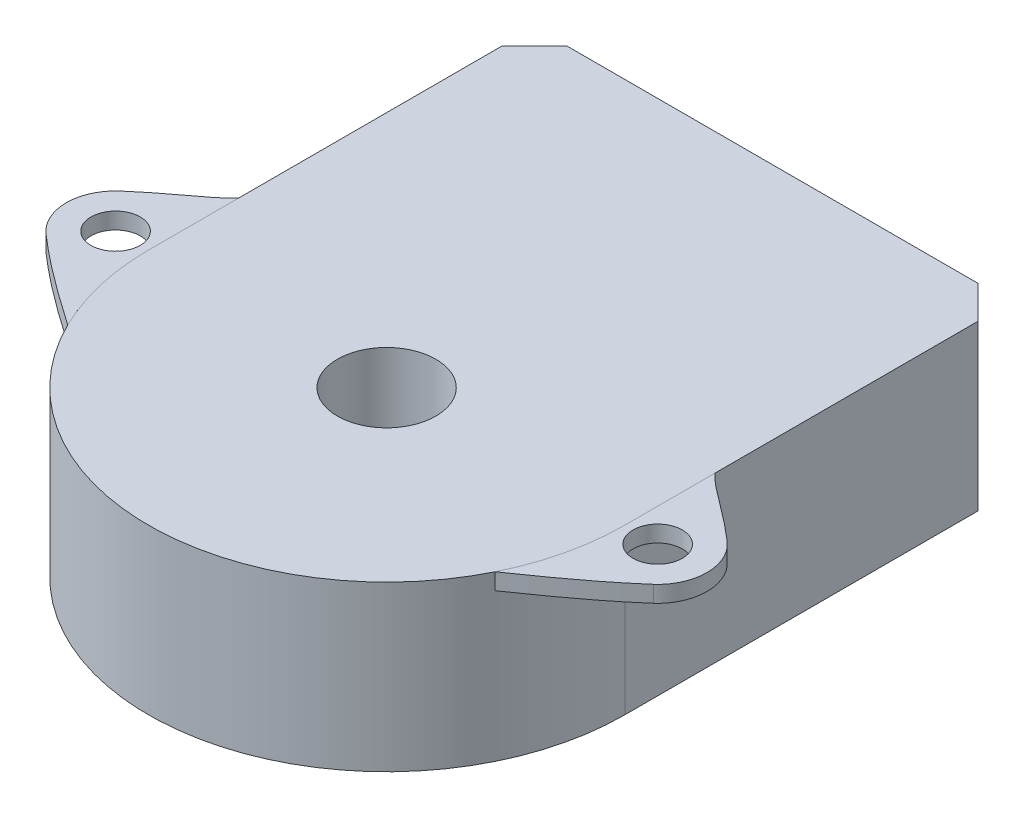
ISO-10303-21;
HEADER;
FILE_DESCRIPTION(('STEP AP214'),'2;1');
FILE_NAME('part.step','',(''),(''),'','','');
FILE_SCHEMA(('AUTOMOTIVE_DESIGN { 1 0 10303 214 1 1 1 1 }'));
ENDSEC;
DATA;
#1=APPLICATION_CONTEXT('core data for automotive mechanical design processes');
#2=APPLICATION_PROTOCOL_DEFINITION('international standard','automotive_design',2000,#1);
#3=PRODUCT_CONTEXT('',#1,'mechanical');
#4=PRODUCT('Part','Part','',(#3));
#5=PRODUCT_RELATED_PRODUCT_CATEGORY('part','',(#4));
#6=PRODUCT_DEFINITION_FORMATION('','',#4);
#7=PRODUCT_DEFINITION_CONTEXT('part definition',#1,'design');
#8=PRODUCT_DEFINITION('design','',#6,#7);
#9=PRODUCT_DEFINITION_SHAPE('','',#8);
#10=(LENGTH_UNIT() NAMED_UNIT(*) SI_UNIT(.MILLI.,.METRE.));
#11=(NAMED_UNIT(*) PLANE_ANGLE_UNIT() SI_UNIT($,.RADIAN.));
#12=(NAMED_UNIT(*) SI_UNIT($,.STERADIAN.) SOLID_ANGLE_UNIT());
#13=UNCERTAINTY_MEASURE_WITH_UNIT(LENGTH_MEASURE(1.E-05),#10,'distance_accuracy_value','');
#14=(GEOMETRIC_REPRESENTATION_CONTEXT(3) GLOBAL_UNCERTAINTY_ASSIGNED_CONTEXT((#13)) GLOBAL_UNIT_ASSIGNED_CONTEXT((#10,
#11,#12)) REPRESENTATION_CONTEXT('',''));
#15=CARTESIAN_POINT('',(0.,0.,0.));
#16=DIRECTION('',(0.,0.,1.));
#17=DIRECTION('',(1.,0.,0.));
#18=AXIS2_PLACEMENT_3D('',#15,#16,#17);
#19=CARTESIAN_POINT('',(-14.5,9.,0.));
#20=DIRECTION('',(-1.,0.,0.));
#21=DIRECTION('',(0.,0.,1.));
#22=AXIS2_PLACEMENT_3D('',#19,#20,#21);
#23=PLANE('',#22);
#24=DIRECTION('',(0.,0.,1.));
#25=VECTOR('',#24,1.);
#26=CARTESIAN_POINT('',(-14.5,10.,0.));
#27=LINE('',#26,#25);
#28=CARTESIAN_POINT('',(-14.5,10.,18.));
#29=VERTEX_POINT('',#28);
#30=CARTESIAN_POINT('',(-14.5,10.,23.5));
#31=VERTEX_POINT('',#30);
#32=EDGE_CURVE('E159',#29,#31,#27,.T.);
#33=ORIENTED_EDGE('',*,*,#32,.T.);
#34=DIRECTION('',(0.,1.,0.));
#35=VECTOR('',#34,1.);
#36=CARTESIAN_POINT('',(-14.5,9.,23.5));
#37=LINE('',#36,#35);
#38=CARTESIAN_POINT('',(-14.5,9.,23.5));
#39=VERTEX_POINT('',#38);
#40=EDGE_CURVE('E12',#39,#31,#37,.T.);
#41=ORIENTED_EDGE('',*,*,#40,.F.);
#42=DIRECTION('',(0.,0.,1.));
#43=VECTOR('',#42,1.);
#44=CARTESIAN_POINT('',(-14.5,9.,0.));
#45=LINE('',#44,#43);
#46=CARTESIAN_POINT('',(-14.5,9.,18.));
#47=VERTEX_POINT('',#46);
#48=EDGE_CURVE('E128',#47,#39,#45,.T.);
#49=ORIENTED_EDGE('',*,*,#48,.F.);
#50=DIRECTION('',(0.,1.,0.));
#51=VECTOR('',#50,1.);
#52=CARTESIAN_POINT('',(-14.5,9.,18.));
#53=LINE('',#52,#51);
#54=EDGE_CURVE('E58',#47,#29,#53,.T.);
#55=ORIENTED_EDGE('',*,*,#54,.T.);
#56=EDGE_LOOP('',(#33,#41,#49,#55));
#57=FACE_BOUND('',#56,.T.);
#58=ADVANCED_FACE('F54',(#57),#23,.F.);
#59=CARTESIAN_POINT('',(0.,9.,23.5));
#60=DIRECTION('',(0.,1.,0.));
#61=DIRECTION('',(0.,0.,1.));
#62=AXIS2_PLACEMENT_3D('',#59,#60,#61);
#63=CYLINDRICAL_SURFACE('',#62,14.5);
#64=CARTESIAN_POINT('',(0.,10.,23.5));
#65=DIRECTION('',(0.,1.,0.));
#66=DIRECTION('',(0.,0.,1.));
#67=AXIS2_PLACEMENT_3D('',#64,#65,#66);
#68=CIRCLE('',#67,14.5);
#69=CARTESIAN_POINT('',(-13.0110739390205,10.,29.9001527289074));
#70=VERTEX_POINT('',#69);
#71=EDGE_CURVE('E89',#31,#70,#68,.T.);
#72=ORIENTED_EDGE('',*,*,#71,.T.);
#73=DIRECTION('',(0.,1.,0.));
#74=VECTOR('',#73,1.);
#75=CARTESIAN_POINT('',(-13.0110739390205,9.,29.9001527289074));
#76=LINE('',#75,#74);
#77=CARTESIAN_POINT('',(-13.0110739390205,9.,29.9001527289074));
#78=VERTEX_POINT('',#77);
#79=EDGE_CURVE('E64',#78,#70,#76,.T.);
#80=ORIENTED_EDGE('',*,*,#79,.F.);
#81=CARTESIAN_POINT('',(0.,9.,23.5));
#82=DIRECTION('',(0.,1.,0.));
#83=DIRECTION('',(0.,0.,1.));
#84=AXIS2_PLACEMENT_3D('',#81,#82,#83);
#85=CIRCLE('',#84,14.5);
#86=EDGE_CURVE('E72',#39,#78,#85,.T.);
#87=ORIENTED_EDGE('',*,*,#86,.F.);
#88=ORIENTED_EDGE('',*,*,#40,.T.);
#89=EDGE_LOOP('',(#72,#80,#87,#88));
#90=FACE_BOUND('',#89,.T.);
#91=ADVANCED_FACE('F146',(#90),#63,.F.);
#92=CARTESIAN_POINT('',(-13.0110739390205,9.,29.9001527289074));
#93=CARTESIAN_POINT('',(-14.9526781140953,9.,28.5683827291695));
#94=CARTESIAN_POINT('',(-16.8993072945415,9.,27.1478440673164));
#95=CARTESIAN_POINT('',(-18.4843134832984,9.,25.75));
#96=B_SPLINE_CURVE_WITH_KNOTS('',3,(#92,#93,#94,#95),.UNSPECIFIED.,.F.,.F.,(4,4),(0.,1.),.UNSPECIFIED.);
#97=DIRECTION('',(0.,1.,0.));
#98=VECTOR('',#97,1.);
#99=SURFACE_OF_LINEAR_EXTRUSION('',#96,#98);
#100=CARTESIAN_POINT('',(-13.0110739390205,10.,29.9001527289074));
#101=CARTESIAN_POINT('',(-14.9526781140953,10.,28.5683827291695));
#102=CARTESIAN_POINT('',(-16.8993072945415,10.,27.1478440673164));
#103=CARTESIAN_POINT('',(-18.4843134832984,10.,25.75));
#104=B_SPLINE_CURVE_WITH_KNOTS('',3,(#100,#101,#102,#103),.UNSPECIFIED.,.F.,.F.,(4,4),(0.,1.),.UNSPECIFIED.);
#105=CARTESIAN_POINT('',(-18.4843134832984,10.,25.75));
#106=VERTEX_POINT('',#105);
#107=EDGE_CURVE('E119',#70,#106,#104,.T.);
#108=ORIENTED_EDGE('',*,*,#107,.T.);
#109=DIRECTION('',(0.,1.,0.));
#110=VECTOR('',#109,1.);
#111=CARTESIAN_POINT('',(-18.4843134832984,9.,25.75));
#112=LINE('',#111,#110);
#113=CARTESIAN_POINT('',(-18.4843134832984,9.,25.75));
#114=VERTEX_POINT('',#113);
#115=EDGE_CURVE('E117',#114,#106,#112,.T.);
#116=ORIENTED_EDGE('',*,*,#115,.F.);
#117=EDGE_CURVE('E107',#78,#114,#96,.T.);
#118=ORIENTED_EDGE('',*,*,#117,.F.);
#119=ORIENTED_EDGE('',*,*,#79,.T.);
#120=EDGE_LOOP('',(#108,#116,#118,#119));
#121=FACE_BOUND('',#120,.T.);
#122=ADVANCED_FACE('F118',(#121),#99,.F.);
#123=CARTESIAN_POINT('',(-16.5,9.,23.5));
#124=DIRECTION('',(0.,1.,0.));
#125=DIRECTION('',(0.,0.,1.));
#126=AXIS2_PLACEMENT_3D('',#123,#124,#125);
#127=CYLINDRICAL_SURFACE('',#126,3.);
#128=CARTESIAN_POINT('',(-16.5,10.,23.5));
#129=DIRECTION('',(0.,1.,0.));
#130=DIRECTION('',(0.,0.,1.));
#131=AXIS2_PLACEMENT_3D('',#128,#129,#130);
#132=CIRCLE('',#131,3.);
#133=CARTESIAN_POINT('',(-18.4843134832985,10.,21.25));
#134=VERTEX_POINT('',#133);
#135=EDGE_CURVE('E164',#106,#134,#132,.F.);
#136=ORIENTED_EDGE('',*,*,#135,.T.);
#137=DIRECTION('',(0.,1.,0.));
#138=VECTOR('',#137,1.);
#139=CARTESIAN_POINT('',(-18.4843134832985,9.,21.25));
#140=LINE('',#139,#138);
#141=CARTESIAN_POINT('',(-18.4843134832985,9.,21.25));
#142=VERTEX_POINT('',#141);
#143=EDGE_CURVE('E123',#142,#134,#140,.T.);
#144=ORIENTED_EDGE('',*,*,#143,.F.);
#145=CARTESIAN_POINT('',(-16.5,9.,23.5));
#146=DIRECTION('',(0.,1.,0.));
#147=DIRECTION('',(0.,0.,1.));
#148=AXIS2_PLACEMENT_3D('',#145,#146,#147);
#149=CIRCLE('',#148,3.);
#150=EDGE_CURVE('E112',#114,#142,#149,.F.);
#151=ORIENTED_EDGE('',*,*,#150,.F.);
#152=ORIENTED_EDGE('',*,*,#115,.T.);
#153=EDGE_LOOP('',(#136,#144,#151,#152));
#154=FACE_BOUND('',#153,.T.);
#155=ADVANCED_FACE('F125',(#154),#127,.T.);
#156=CARTESIAN_POINT('',(-16.5,9.,23.5));
#157=DIRECTION('',(0.,1.,0.));
#158=DIRECTION('',(0.,0.,1.));
#159=AXIS2_PLACEMENT_3D('',#156,#157,#158);
#160=CYLINDRICAL_SURFACE('',#159,1.5);
#161=CARTESIAN_POINT('',(-16.5,9.,23.5));
#162=DIRECTION('',(0.,1.,0.));
#163=DIRECTION('',(0.,0.,1.));
#164=AXIS2_PLACEMENT_3D('',#161,#162,#163);
#165=CIRCLE('',#164,1.5);
#166=CARTESIAN_POINT('',(-16.5,9.,25.));
#167=VERTEX_POINT('',#166);
#168=EDGE_CURVE('E180',#167,#167,#165,.F.);
#169=ORIENTED_EDGE('',*,*,#168,.T.);
#170=EDGE_LOOP('',(#169));
#171=FACE_BOUND('',#170,.T.);
#172=CARTESIAN_POINT('',(-16.5,10.,23.5));
#173=DIRECTION('',(0.,1.,0.));
#174=DIRECTION('',(0.,0.,1.));
#175=AXIS2_PLACEMENT_3D('',#172,#173,#174);
#176=CIRCLE('',#175,1.5);
#177=CARTESIAN_POINT('',(-16.5,10.,25.));
#178=VERTEX_POINT('',#177);
#179=EDGE_CURVE('E162',#178,#178,#176,.F.);
#180=ORIENTED_EDGE('',*,*,#179,.F.);
#181=EDGE_LOOP('',(#180));
#182=FACE_BOUND('',#181,.T.);
#183=ADVANCED_FACE('F56',(#171,#182),#160,.F.);
#184=CARTESIAN_POINT('',(-14.5,9.,18.));
#185=CARTESIAN_POINT('',(-14.9514744746818,9.,18.6272611219658));
#186=CARTESIAN_POINT('',(-16.8642691413943,9.,19.8212551861414));
#187=CARTESIAN_POINT('',(-18.4843134832985,9.,21.25));
#188=B_SPLINE_CURVE_WITH_KNOTS('',3,(#184,#185,#186,#187),.UNSPECIFIED.,.F.,.F.,(4,4),
(0.453928844211308,1.),.UNSPECIFIED.);
#189=DIRECTION('',(0.,1.,0.));
#190=VECTOR('',#189,1.);
#191=SURFACE_OF_LINEAR_EXTRUSION('',#188,#190);
#192=CARTESIAN_POINT('',(-14.5,10.,18.));
#193=CARTESIAN_POINT('',(-14.9514744746818,10.,18.6272611219658));
#194=CARTESIAN_POINT('',(-16.8642691413943,10.,19.8212551861414));
#195=CARTESIAN_POINT('',(-18.4843134832985,10.,21.25));
#196=B_SPLINE_CURVE_WITH_KNOTS('',3,(#192,#193,#194,#195),.UNSPECIFIED.,.F.,.F.,(4,4),
(0.453928844211308,1.),.UNSPECIFIED.);
#197=EDGE_CURVE('E161',#29,#134,#196,.T.);
#198=ORIENTED_EDGE('',*,*,#197,.F.);
#199=ORIENTED_EDGE('',*,*,#54,.F.);
#200=EDGE_CURVE('E126',#47,#142,#188,.T.);
#201=ORIENTED_EDGE('',*,*,#200,.T.);
#202=ORIENTED_EDGE('',*,*,#143,.T.);
#203=EDGE_LOOP('',(#198,#199,#201,#202));
#204=FACE_BOUND('',#203,.T.);
#205=ADVANCED_FACE('F150',(#204),#191,.T.);
#206=CARTESIAN_POINT('',(0.,9.,0.));
#207=DIRECTION('',(0.,1.,0.));
#208=DIRECTION('',(0.,0.,1.));
#209=AXIS2_PLACEMENT_3D('',#206,#207,#208);
#210=PLANE('',#209);
#211=ORIENTED_EDGE('',*,*,#168,.F.);
#212=EDGE_LOOP('',(#211));
#213=FACE_BOUND('',#212,.T.);
#214=ORIENTED_EDGE('',*,*,#48,.T.);
#215=ORIENTED_EDGE('',*,*,#86,.T.);
#216=ORIENTED_EDGE('',*,*,#117,.T.);
#217=ORIENTED_EDGE('',*,*,#150,.T.);
#218=ORIENTED_EDGE('',*,*,#200,.F.);
#219=EDGE_LOOP('',(#214,#215,#216,#217,#218));
#220=FACE_BOUND('',#219,.T.);
#221=ADVANCED_FACE('F109',(#213,#220),#210,.F.);
#222=CARTESIAN_POINT('',(0.,10.,0.));
#223=DIRECTION('',(0.,1.,0.));
#224=DIRECTION('',(0.,0.,1.));
#225=AXIS2_PLACEMENT_3D('',#222,#223,#224);
#226=PLANE('',#225);
#227=ORIENTED_EDGE('',*,*,#179,.T.);
#228=EDGE_LOOP('',(#227));
#229=FACE_BOUND('',#228,.T.);
#230=ORIENTED_EDGE('',*,*,#32,.F.);
#231=ORIENTED_EDGE('',*,*,#197,.T.);
#232=ORIENTED_EDGE('',*,*,#135,.F.);
#233=ORIENTED_EDGE('',*,*,#107,.F.);
#234=ORIENTED_EDGE('',*,*,#71,.F.);
#235=EDGE_LOOP('',(#230,#231,#232,#233,#234));
#236=FACE_BOUND('',#235,.T.);
#237=ADVANCED_FACE('F182',(#229,#236),#226,.T.);
#238=CLOSED_SHELL('',(#58,#91,#122,#155,#183,#205,#221,#237));
#239=MANIFOLD_SOLID_BREP('B2',#238);
#240=CARTESIAN_POINT('',(14.5,9.,18.));
#241=CARTESIAN_POINT('',(14.9514744746818,9.,18.6272611219658));
#242=CARTESIAN_POINT('',(16.8642691413943,9.,19.8212551861414));
#243=CARTESIAN_POINT('',(18.4843134832985,9.,21.25));
#244=B_SPLINE_CURVE_WITH_KNOTS('',3,(#240,#241,#242,#243),.UNSPECIFIED.,.F.,.F.,(4,4),
(0.453928844211308,1.),.UNSPECIFIED.);
#245=DIRECTION('',(0.,1.,0.));
#246=VECTOR('',#245,1.);
#247=SURFACE_OF_LINEAR_EXTRUSION('',#244,#246);
#248=CARTESIAN_POINT('',(14.5,10.,18.));
#249=CARTESIAN_POINT('',(14.9514744746818,10.,18.6272611219658));
#250=CARTESIAN_POINT('',(16.8642691413943,10.,19.8212551861414));
#251=CARTESIAN_POINT('',(18.4843134832985,10.,21.25));
#252=B_SPLINE_CURVE_WITH_KNOTS('',3,(#248,#249,#250,#251),.UNSPECIFIED.,.F.,.F.,(4,4),
(0.453928844211308,1.),.UNSPECIFIED.);
#253=CARTESIAN_POINT('',(14.5,10.,18.));
#254=VERTEX_POINT('',#253);
#255=CARTESIAN_POINT('',(18.4843134832985,10.,21.25));
#256=VERTEX_POINT('',#255);
#257=EDGE_CURVE('E366',#254,#256,#252,.T.);
#258=ORIENTED_EDGE('',*,*,#257,.T.);
#259=DIRECTION('',(0.,1.,0.));
#260=VECTOR('',#259,1.);
#261=CARTESIAN_POINT('',(18.4843134832985,9.,21.25));
#262=LINE('',#261,#260);
#263=CARTESIAN_POINT('',(18.4843134832985,9.,21.25));
#264=VERTEX_POINT('',#263);
#265=EDGE_CURVE('E52',#264,#256,#262,.T.);
#266=ORIENTED_EDGE('',*,*,#265,.F.);
#267=CARTESIAN_POINT('',(14.5,9.,18.));
#268=VERTEX_POINT('',#267);
#269=EDGE_CURVE('E281',#268,#264,#244,.T.);
#270=ORIENTED_EDGE('',*,*,#269,.F.);
#271=DIRECTION('',(0.,1.,0.));
#272=VECTOR('',#271,1.);
#273=CARTESIAN_POINT('',(14.5,9.,18.));
#274=LINE('',#273,#272);
#275=EDGE_CURVE('E266',#268,#254,#274,.T.);
#276=ORIENTED_EDGE('',*,*,#275,.T.);
#277=EDGE_LOOP('',(#258,#266,#270,#276));
#278=FACE_BOUND('',#277,.T.);
#279=ADVANCED_FACE('F262',(#278),#247,.F.);
#280=CARTESIAN_POINT('',(16.5,9.,23.5));
#281=DIRECTION('',(0.,1.,0.));
#282=DIRECTION('',(0.,0.,1.));
#283=AXIS2_PLACEMENT_3D('',#280,#281,#282);
#284=CYLINDRICAL_SURFACE('',#283,3.);
#285=CARTESIAN_POINT('',(16.5,10.,23.5));
#286=DIRECTION('',(0.,1.,0.));
#287=DIRECTION('',(0.,0.,1.));
#288=AXIS2_PLACEMENT_3D('',#285,#286,#287);
#289=CIRCLE('',#288,3.);
#290=CARTESIAN_POINT('',(18.4843134832984,10.,25.75));
#291=VERTEX_POINT('',#290);
#292=EDGE_CURVE('E372',#291,#256,#289,.T.);
#293=ORIENTED_EDGE('',*,*,#292,.F.);
#294=DIRECTION('',(0.,1.,0.));
#295=VECTOR('',#294,1.);
#296=CARTESIAN_POINT('',(18.4843134832984,9.,25.75));
#297=LINE('',#296,#295);
#298=CARTESIAN_POINT('',(18.4843134832984,9.,25.75));
#299=VERTEX_POINT('',#298);
#300=EDGE_CURVE('E272',#299,#291,#297,.T.);
#301=ORIENTED_EDGE('',*,*,#300,.F.);
#302=CARTESIAN_POINT('',(16.5,9.,23.5));
#303=DIRECTION('',(0.,1.,0.));
#304=DIRECTION('',(0.,0.,1.));
#305=AXIS2_PLACEMENT_3D('',#302,#303,#304);
#306=CIRCLE('',#305,3.);
#307=EDGE_CURVE('E332',#299,#264,#306,.T.);
#308=ORIENTED_EDGE('',*,*,#307,.T.);
#309=ORIENTED_EDGE('',*,*,#265,.T.);
#310=EDGE_LOOP('',(#293,#301,#308,#309));
#311=FACE_BOUND('',#310,.T.);
#312=ADVANCED_FACE('F348',(#311),#284,.T.);
#313=CARTESIAN_POINT('',(13.0110739390205,9.,29.9001527289074));
#314=CARTESIAN_POINT('',(14.9526781140953,9.,28.5683827291695));
#315=CARTESIAN_POINT('',(16.8993072945415,9.,27.1478440673164));
#316=CARTESIAN_POINT('',(18.4843134832984,9.,25.75));
#317=B_SPLINE_CURVE_WITH_KNOTS('',3,(#313,#314,#315,#316),.UNSPECIFIED.,.F.,.F.,(4,4),(0.,1.),.UNSPECIFIED.);
#318=DIRECTION('',(0.,1.,0.));
#319=VECTOR('',#318,1.);
#320=SURFACE_OF_LINEAR_EXTRUSION('',#317,#319);
#321=CARTESIAN_POINT('',(13.0110739390205,10.,29.9001527289074));
#322=CARTESIAN_POINT('',(14.9526781140953,10.,28.5683827291695));
#323=CARTESIAN_POINT('',(16.8993072945415,10.,27.1478440673164));
#324=CARTESIAN_POINT('',(18.4843134832984,10.,25.75));
#325=B_SPLINE_CURVE_WITH_KNOTS('',3,(#321,#322,#323,#324),.UNSPECIFIED.,.F.,.F.,(4,4),(0.,1.),.UNSPECIFIED.);
#326=CARTESIAN_POINT('',(13.0110739390205,10.,29.9001527289074));
#327=VERTEX_POINT('',#326);
#328=EDGE_CURVE('E320',#327,#291,#325,.T.);
#329=ORIENTED_EDGE('',*,*,#328,.F.);
#330=DIRECTION('',(0.,1.,0.));
#331=VECTOR('',#330,1.);
#332=CARTESIAN_POINT('',(13.0110739390205,9.,29.9001527289074));
#333=LINE('',#332,#331);
#334=CARTESIAN_POINT('',(13.0110739390205,9.,29.9001527289074));
#335=VERTEX_POINT('',#334);
#336=EDGE_CURVE('E315',#335,#327,#333,.T.);
#337=ORIENTED_EDGE('',*,*,#336,.F.);
#338=EDGE_CURVE('E319',#335,#299,#317,.T.);
#339=ORIENTED_EDGE('',*,*,#338,.T.);
#340=ORIENTED_EDGE('',*,*,#300,.T.);
#341=EDGE_LOOP('',(#329,#337,#339,#340));
#342=FACE_BOUND('',#341,.T.);
#343=ADVANCED_FACE('F317',(#342),#320,.T.);
#344=CARTESIAN_POINT('',(0.,9.,23.5));
#345=DIRECTION('',(0.,1.,0.));
#346=DIRECTION('',(0.,0.,1.));
#347=AXIS2_PLACEMENT_3D('',#344,#345,#346);
#348=CYLINDRICAL_SURFACE('',#347,14.5);
#349=CARTESIAN_POINT('',(0.,10.,23.5));
#350=DIRECTION('',(0.,1.,0.));
#351=DIRECTION('',(0.,0.,1.));
#352=AXIS2_PLACEMENT_3D('',#349,#350,#351);
#353=CIRCLE('',#352,14.5);
#354=CARTESIAN_POINT('',(14.5,10.,23.5));
#355=VERTEX_POINT('',#354);
#356=EDGE_CURVE('E379',#327,#355,#353,.T.);
#357=ORIENTED_EDGE('',*,*,#356,.T.);
#358=DIRECTION('',(0.,1.,0.));
#359=VECTOR('',#358,1.);
#360=CARTESIAN_POINT('',(14.5,9.,23.5));
#361=LINE('',#360,#359);
#362=CARTESIAN_POINT('',(14.5,9.,23.5));
#363=VERTEX_POINT('',#362);
#364=EDGE_CURVE('E323',#363,#355,#361,.T.);
#365=ORIENTED_EDGE('',*,*,#364,.F.);
#366=CARTESIAN_POINT('',(0.,9.,23.5));
#367=DIRECTION('',(0.,1.,0.));
#368=DIRECTION('',(0.,0.,1.));
#369=AXIS2_PLACEMENT_3D('',#366,#367,#368);
#370=CIRCLE('',#369,14.5);
#371=EDGE_CURVE('E326',#335,#363,#370,.T.);
#372=ORIENTED_EDGE('',*,*,#371,.F.);
#373=ORIENTED_EDGE('',*,*,#336,.T.);
#374=EDGE_LOOP('',(#357,#365,#372,#373));
#375=FACE_BOUND('',#374,.T.);
#376=ADVANCED_FACE('F327',(#375),#348,.F.);
#377=CARTESIAN_POINT('',(14.5,9.,0.));
#378=DIRECTION('',(1.,0.,0.));
#379=DIRECTION('',(0.,0.,-1.));
#380=AXIS2_PLACEMENT_3D('',#377,#378,#379);
#381=PLANE('',#380);
#382=DIRECTION('',(0.,0.,-1.));
#383=VECTOR('',#382,1.);
#384=CARTESIAN_POINT('',(14.5,10.,0.));
#385=LINE('',#384,#383);
#386=EDGE_CURVE('E370',#355,#254,#385,.T.);
#387=ORIENTED_EDGE('',*,*,#386,.T.);
#388=ORIENTED_EDGE('',*,*,#275,.F.);
#389=DIRECTION('',(0.,0.,-1.));
#390=VECTOR('',#389,1.);
#391=CARTESIAN_POINT('',(14.5,9.,0.));
#392=LINE('',#391,#390);
#393=EDGE_CURVE('E311',#363,#268,#392,.T.);
#394=ORIENTED_EDGE('',*,*,#393,.F.);
#395=ORIENTED_EDGE('',*,*,#364,.T.);
#396=EDGE_LOOP('',(#387,#388,#394,#395));
#397=FACE_BOUND('',#396,.T.);
#398=ADVANCED_FACE('F351',(#397),#381,.F.);
#399=CARTESIAN_POINT('',(16.5,9.,23.5));
#400=DIRECTION('',(0.,1.,0.));
#401=DIRECTION('',(0.,0.,1.));
#402=AXIS2_PLACEMENT_3D('',#399,#400,#401);
#403=CYLINDRICAL_SURFACE('',#402,1.5);
#404=CARTESIAN_POINT('',(16.5,9.,23.5));
#405=DIRECTION('',(0.,1.,0.));
#406=DIRECTION('',(0.,0.,1.));
#407=AXIS2_PLACEMENT_3D('',#404,#405,#406);
#408=CIRCLE('',#407,1.5);
#409=CARTESIAN_POINT('',(16.5,9.,25.));
#410=VERTEX_POINT('',#409);
#411=EDGE_CURVE('E334',#410,#410,#408,.T.);
#412=ORIENTED_EDGE('',*,*,#411,.F.);
#413=EDGE_LOOP('',(#412));
#414=FACE_BOUND('',#413,.T.);
#415=CARTESIAN_POINT('',(16.5,10.,23.5));
#416=DIRECTION('',(0.,1.,0.));
#417=DIRECTION('',(0.,0.,1.));
#418=AXIS2_PLACEMENT_3D('',#415,#416,#417);
#419=CIRCLE('',#418,1.5);
#420=CARTESIAN_POINT('',(16.5,10.,25.));
#421=VERTEX_POINT('',#420);
#422=EDGE_CURVE('E375',#421,#421,#419,.T.);
#423=ORIENTED_EDGE('',*,*,#422,.T.);
#424=EDGE_LOOP('',(#423));
#425=FACE_BOUND('',#424,.T.);
#426=ADVANCED_FACE('F353',(#414,#425),#403,.F.);
#427=CARTESIAN_POINT('',(0.,9.,0.));
#428=DIRECTION('',(0.,1.,0.));
#429=DIRECTION('',(0.,0.,1.));
#430=AXIS2_PLACEMENT_3D('',#427,#428,#429);
#431=PLANE('',#430);
#432=ORIENTED_EDGE('',*,*,#269,.T.);
#433=ORIENTED_EDGE('',*,*,#307,.F.);
#434=ORIENTED_EDGE('',*,*,#338,.F.);
#435=ORIENTED_EDGE('',*,*,#371,.T.);
#436=ORIENTED_EDGE('',*,*,#393,.T.);
#437=EDGE_LOOP('',(#432,#433,#434,#435,#436));
#438=FACE_BOUND('',#437,.T.);
#439=ORIENTED_EDGE('',*,*,#411,.T.);
#440=EDGE_LOOP('',(#439));
#441=FACE_BOUND('',#440,.T.);
#442=ADVANCED_FACE('F330',(#438,#441),#431,.F.);
#443=CARTESIAN_POINT('',(0.,10.,0.));
#444=DIRECTION('',(0.,1.,0.));
#445=DIRECTION('',(0.,0.,1.));
#446=AXIS2_PLACEMENT_3D('',#443,#444,#445);
#447=PLANE('',#446);
#448=ORIENTED_EDGE('',*,*,#257,.F.);
#449=ORIENTED_EDGE('',*,*,#386,.F.);
#450=ORIENTED_EDGE('',*,*,#356,.F.);
#451=ORIENTED_EDGE('',*,*,#328,.T.);
#452=ORIENTED_EDGE('',*,*,#292,.T.);
#453=EDGE_LOOP('',(#448,#449,#450,#451,#452));
#454=FACE_BOUND('',#453,.T.);
#455=ORIENTED_EDGE('',*,*,#422,.F.);
#456=EDGE_LOOP('',(#455));
#457=FACE_BOUND('',#456,.T.);
#458=ADVANCED_FACE('F373',(#454,#457),#447,.T.);
#459=CLOSED_SHELL('',(#279,#312,#343,#376,#398,#426,#442,#458));
#460=MANIFOLD_SOLID_BREP('B6',#459);
#461=CARTESIAN_POINT('',(0.,10.,23.5));
#462=DIRECTION('',(0.,-1.,0.));
#463=DIRECTION('',(0.,0.,-1.));
#464=AXIS2_PLACEMENT_3D('',#461,#462,#463);
#465=CYLINDRICAL_SURFACE('',#464,14.5);
#466=CARTESIAN_POINT('',(0.,0.,23.5));
#467=DIRECTION('',(0.,1.,0.));
#468=DIRECTION('',(0.,0.,1.));
#469=AXIS2_PLACEMENT_3D('',#466,#467,#468);
#470=CIRCLE('',#469,14.5);
#471=CARTESIAN_POINT('',(-14.5,0.,23.5));
#472=VERTEX_POINT('',#471);
#473=CARTESIAN_POINT('',(14.5,0.,23.5));
#474=VERTEX_POINT('',#473);
#475=EDGE_CURVE('E534',#472,#474,#470,.T.);
#476=ORIENTED_EDGE('',*,*,#475,.T.);
#477=DIRECTION('',(0.,-1.,0.));
#478=VECTOR('',#477,1.);
#479=CARTESIAN_POINT('',(14.5,10.,23.5));
#480=LINE('',#479,#478);
#481=CARTESIAN_POINT('',(14.5,10.,23.5));
#482=VERTEX_POINT('',#481);
#483=EDGE_CURVE('E518',#482,#474,#480,.T.);
#484=ORIENTED_EDGE('',*,*,#483,.F.);
#485=CARTESIAN_POINT('',(0.,10.,23.5));
#486=DIRECTION('',(0.,1.,0.));
#487=DIRECTION('',(0.,0.,1.));
#488=AXIS2_PLACEMENT_3D('',#485,#486,#487);
#489=CIRCLE('',#488,14.5);
#490=CARTESIAN_POINT('',(-14.5,10.,23.5));
#491=VERTEX_POINT('',#490);
#492=EDGE_CURVE('E523',#491,#482,#489,.T.);
#493=ORIENTED_EDGE('',*,*,#492,.F.);
#494=DIRECTION('',(0.,-1.,0.));
#495=VECTOR('',#494,1.);
#496=CARTESIAN_POINT('',(-14.5,10.,23.5));
#497=LINE('',#496,#495);
#498=EDGE_CURVE('E536',#491,#472,#497,.T.);
#499=ORIENTED_EDGE('',*,*,#498,.T.);
#500=EDGE_LOOP('',(#476,#484,#493,#499));
#501=FACE_BOUND('',#500,.T.);
#502=ADVANCED_FACE('F461',(#501),#465,.T.);
#503=CARTESIAN_POINT('',(14.5,10.,0.));
#504=DIRECTION('',(-1.,0.,0.));
#505=DIRECTION('',(0.,0.,1.));
#506=AXIS2_PLACEMENT_3D('',#503,#504,#505);
#507=PLANE('',#506);
#508=DIRECTION('',(0.,0.,-1.));
#509=VECTOR('',#508,1.);
#510=CARTESIAN_POINT('',(14.5,0.,0.));
#511=LINE('',#510,#509);
#512=CARTESIAN_POINT('',(14.5,0.,2.));
#513=VERTEX_POINT('',#512);
#514=EDGE_CURVE('E568',#474,#513,#511,.T.);
#515=ORIENTED_EDGE('',*,*,#514,.T.);
#516=DIRECTION('',(0.,1.,0.));
#517=VECTOR('',#516,1.);
#518=CARTESIAN_POINT('',(14.5,10.,2.));
#519=LINE('',#518,#517);
#520=CARTESIAN_POINT('',(14.5,10.,2.));
#521=VERTEX_POINT('',#520);
#522=EDGE_CURVE('E260',#513,#521,#519,.T.);
#523=ORIENTED_EDGE('',*,*,#522,.T.);
#524=DIRECTION('',(0.,0.,-1.));
#525=VECTOR('',#524,1.);
#526=CARTESIAN_POINT('',(14.5,10.,0.));
#527=LINE('',#526,#525);
#528=EDGE_CURVE('E514',#482,#521,#527,.T.);
#529=ORIENTED_EDGE('',*,*,#528,.F.);
#530=ORIENTED_EDGE('',*,*,#483,.T.);
#531=EDGE_LOOP('',(#515,#523,#529,#530));
#532=FACE_BOUND('',#531,.T.);
#533=ADVANCED_FACE('F516',(#532),#507,.F.);
#534=CARTESIAN_POINT('',(0.,10.,0.));
#535=DIRECTION('',(0.,0.,1.));
#536=DIRECTION('',(1.,0.,0.));
#537=AXIS2_PLACEMENT_3D('',#534,#535,#536);
#538=PLANE('',#537);
#539=DIRECTION('',(-1.,0.,0.));
#540=VECTOR('',#539,1.);
#541=CARTESIAN_POINT('',(0.,0.,0.));
#542=LINE('',#541,#540);
#543=CARTESIAN_POINT('',(12.5,0.,0.));
#544=VERTEX_POINT('',#543);
#545=CARTESIAN_POINT('',(-12.5,0.,0.));
#546=VERTEX_POINT('',#545);
#547=EDGE_CURVE('E564',#544,#546,#542,.T.);
#548=ORIENTED_EDGE('',*,*,#547,.T.);
#549=DIRECTION('',(0.,1.,0.));
#550=VECTOR('',#549,1.);
#551=CARTESIAN_POINT('',(-12.5,10.,0.));
#552=LINE('',#551,#550);
#553=CARTESIAN_POINT('',(-12.5,10.,0.));
#554=VERTEX_POINT('',#553);
#555=EDGE_CURVE('E483',#546,#554,#552,.T.);
#556=ORIENTED_EDGE('',*,*,#555,.T.);
#557=DIRECTION('',(-1.,0.,0.));
#558=VECTOR('',#557,1.);
#559=CARTESIAN_POINT('',(0.,10.,0.));
#560=LINE('',#559,#558);
#561=CARTESIAN_POINT('',(12.5,10.,0.));
#562=VERTEX_POINT('',#561);
#563=EDGE_CURVE('E522',#562,#554,#560,.T.);
#564=ORIENTED_EDGE('',*,*,#563,.F.);
#565=DIRECTION('',(0.,-1.,0.));
#566=VECTOR('',#565,1.);
#567=CARTESIAN_POINT('',(12.5,10.,0.));
#568=LINE('',#567,#566);
#569=EDGE_CURVE('E547',#562,#544,#568,.T.);
#570=ORIENTED_EDGE('',*,*,#569,.T.);
#571=EDGE_LOOP('',(#548,#556,#564,#570));
#572=FACE_BOUND('',#571,.T.);
#573=ADVANCED_FACE('F566',(#572),#538,.F.);
#574=CARTESIAN_POINT('',(0.,10.,23.5));
#575=DIRECTION('',(0.,-1.,0.));
#576=DIRECTION('',(0.,0.,-1.));
#577=AXIS2_PLACEMENT_3D('',#574,#575,#576);
#578=CYLINDRICAL_SURFACE('',#577,3.);
#579=CARTESIAN_POINT('',(0.,10.,23.5));
#580=DIRECTION('',(0.,1.,0.));
#581=DIRECTION('',(0.,0.,1.));
#582=AXIS2_PLACEMENT_3D('',#579,#580,#581);
#583=CIRCLE('',#582,3.);
#584=CARTESIAN_POINT('',(0.,10.,26.5));
#585=VERTEX_POINT('',#584);
#586=EDGE_CURVE('E531',#585,#585,#583,.T.);
#587=ORIENTED_EDGE('',*,*,#586,.T.);
#588=EDGE_LOOP('',(#587));
#589=FACE_BOUND('',#588,.T.);
#590=CARTESIAN_POINT('',(0.,0.,23.5));
#591=DIRECTION('',(0.,1.,0.));
#592=DIRECTION('',(0.,0.,1.));
#593=AXIS2_PLACEMENT_3D('',#590,#591,#592);
#594=CIRCLE('',#593,3.);
#595=CARTESIAN_POINT('',(0.,0.,26.5));
#596=VERTEX_POINT('',#595);
#597=EDGE_CURVE('E573',#596,#596,#594,.T.);
#598=ORIENTED_EDGE('',*,*,#597,.F.);
#599=EDGE_LOOP('',(#598));
#600=FACE_BOUND('',#599,.T.);
#601=ADVANCED_FACE('F580',(#589,#600),#578,.F.);
#602=CARTESIAN_POINT('',(-14.5,10.,0.));
#603=DIRECTION('',(-1.,0.,0.));
#604=DIRECTION('',(0.,0.,1.));
#605=AXIS2_PLACEMENT_3D('',#602,#603,#604);
#606=PLANE('',#605);
#607=DIRECTION('',(0.,0.,-1.));
#608=VECTOR('',#607,1.);
#609=CARTESIAN_POINT('',(-14.5,10.,0.));
#610=LINE('',#609,#608);
#611=CARTESIAN_POINT('',(-14.5,10.,2.00000000000002));
#612=VERTEX_POINT('',#611);
#613=EDGE_CURVE('E529',#491,#612,#610,.T.);
#614=ORIENTED_EDGE('',*,*,#613,.T.);
#615=DIRECTION('',(0.,-1.,0.));
#616=VECTOR('',#615,1.);
#617=CARTESIAN_POINT('',(-14.5,0.,2.00000000000002));
#618=LINE('',#617,#616);
#619=CARTESIAN_POINT('',(-14.5,0.,2.00000000000002));
#620=VERTEX_POINT('',#619);
#621=EDGE_CURVE('E535',#612,#620,#618,.T.);
#622=ORIENTED_EDGE('',*,*,#621,.T.);
#623=DIRECTION('',(0.,0.,-1.));
#624=VECTOR('',#623,1.);
#625=CARTESIAN_POINT('',(-14.5,0.,0.));
#626=LINE('',#625,#624);
#627=EDGE_CURVE('E565',#472,#620,#626,.T.);
#628=ORIENTED_EDGE('',*,*,#627,.F.);
#629=ORIENTED_EDGE('',*,*,#498,.F.);
#630=EDGE_LOOP('',(#614,#622,#628,#629));
#631=FACE_BOUND('',#630,.T.);
#632=ADVANCED_FACE('F556',(#631),#606,.T.);
#633=CARTESIAN_POINT('',(0.,10.,0.));
#634=DIRECTION('',(0.,1.,0.));
#635=DIRECTION('',(0.,0.,1.));
#636=AXIS2_PLACEMENT_3D('',#633,#634,#635);
#637=PLANE('',#636);
#638=ORIENTED_EDGE('',*,*,#586,.F.);
#639=EDGE_LOOP('',(#638));
#640=FACE_BOUND('',#639,.T.);
#641=ORIENTED_EDGE('',*,*,#563,.T.);
#642=DIRECTION('',(-0.707106781186549,0.,0.707106781186546));
#643=VECTOR('',#642,1.);
#644=CARTESIAN_POINT('',(-6.24999999999996,10.,-6.24999999999999));
#645=LINE('',#644,#643);
#646=EDGE_CURVE('E470',#554,#612,#645,.T.);
#647=ORIENTED_EDGE('',*,*,#646,.T.);
#648=ORIENTED_EDGE('',*,*,#613,.F.);
#649=ORIENTED_EDGE('',*,*,#492,.T.);
#650=ORIENTED_EDGE('',*,*,#528,.T.);
#651=DIRECTION('',(0.707106781186546,0.,0.707106781186549));
#652=VECTOR('',#651,1.);
#653=CARTESIAN_POINT('',(6.25000000000003,10.,-6.25));
#654=LINE('',#653,#652);
#655=EDGE_CURVE('E551',#521,#562,#654,.F.);
#656=ORIENTED_EDGE('',*,*,#655,.T.);
#657=EDGE_LOOP('',(#641,#647,#648,#649,#650,#656));
#658=FACE_BOUND('',#657,.T.);
#659=ADVANCED_FACE('F527',(#640,#658),#637,.T.);
#660=CARTESIAN_POINT('',(0.,0.,0.));
#661=DIRECTION('',(0.,1.,0.));
#662=DIRECTION('',(0.,0.,1.));
#663=AXIS2_PLACEMENT_3D('',#660,#661,#662);
#664=PLANE('',#663);
#665=ORIENTED_EDGE('',*,*,#597,.T.);
#666=EDGE_LOOP('',(#665));
#667=FACE_BOUND('',#666,.T.);
#668=ORIENTED_EDGE('',*,*,#627,.T.);
#669=DIRECTION('',(0.707106781186549,0.,-0.707106781186546));
#670=VECTOR('',#669,1.);
#671=CARTESIAN_POINT('',(-14.5,0.,2.00000000000002));
#672=LINE('',#671,#670);
#673=EDGE_CURVE('E545',#620,#546,#672,.T.);
#674=ORIENTED_EDGE('',*,*,#673,.T.);
#675=ORIENTED_EDGE('',*,*,#547,.F.);
#676=DIRECTION('',(-0.707106781186546,0.,-0.707106781186549));
#677=VECTOR('',#676,1.);
#678=CARTESIAN_POINT('',(12.5,0.,0.));
#679=LINE('',#678,#677);
#680=EDGE_CURVE('E539',#544,#513,#679,.F.);
#681=ORIENTED_EDGE('',*,*,#680,.T.);
#682=ORIENTED_EDGE('',*,*,#514,.F.);
#683=ORIENTED_EDGE('',*,*,#475,.F.);
#684=EDGE_LOOP('',(#668,#674,#675,#681,#682,#683));
#685=FACE_BOUND('',#684,.T.);
#686=ADVANCED_FACE('F563',(#667,#685),#664,.F.);
#687=CARTESIAN_POINT('',(-14.5,10.,2.00000000000002));
#688=DIRECTION('',(-0.707106781186546,0.,-0.707106781186549));
#689=DIRECTION('',(0.,1.,0.));
#690=AXIS2_PLACEMENT_3D('',#687,#688,#689);
#691=PLANE('',#690);
#692=ORIENTED_EDGE('',*,*,#646,.F.);
#693=ORIENTED_EDGE('',*,*,#555,.F.);
#694=ORIENTED_EDGE('',*,*,#673,.F.);
#695=ORIENTED_EDGE('',*,*,#621,.F.);
#696=EDGE_LOOP('',(#692,#693,#694,#695));
#697=FACE_BOUND('',#696,.T.);
#698=ADVANCED_FACE('F560',(#697),#691,.T.);
#699=CARTESIAN_POINT('',(12.5,10.,0.));
#700=DIRECTION('',(-0.707106781186549,0.,0.707106781186546));
#701=DIRECTION('',(0.,-1.,0.));
#702=AXIS2_PLACEMENT_3D('',#699,#700,#701);
#703=PLANE('',#702);
#704=ORIENTED_EDGE('',*,*,#655,.F.);
#705=ORIENTED_EDGE('',*,*,#522,.F.);
#706=ORIENTED_EDGE('',*,*,#680,.F.);
#707=ORIENTED_EDGE('',*,*,#569,.F.);
#708=EDGE_LOOP('',(#704,#705,#706,#707));
#709=FACE_BOUND('',#708,.T.);
#710=ADVANCED_FACE('F464',(#709),#703,.F.);
#711=CLOSED_SHELL('',(#502,#533,#573,#601,#632,#659,#686,#698,#710));
#712=MANIFOLD_SOLID_BREP('B46',#711);
#713=ADVANCED_BREP_SHAPE_REPRESENTATION('',(#18,#239,#460,#712),#14);
#714=SHAPE_DEFINITION_REPRESENTATION(#9,#713);
ENDSEC;
END-ISO-10303-21;
